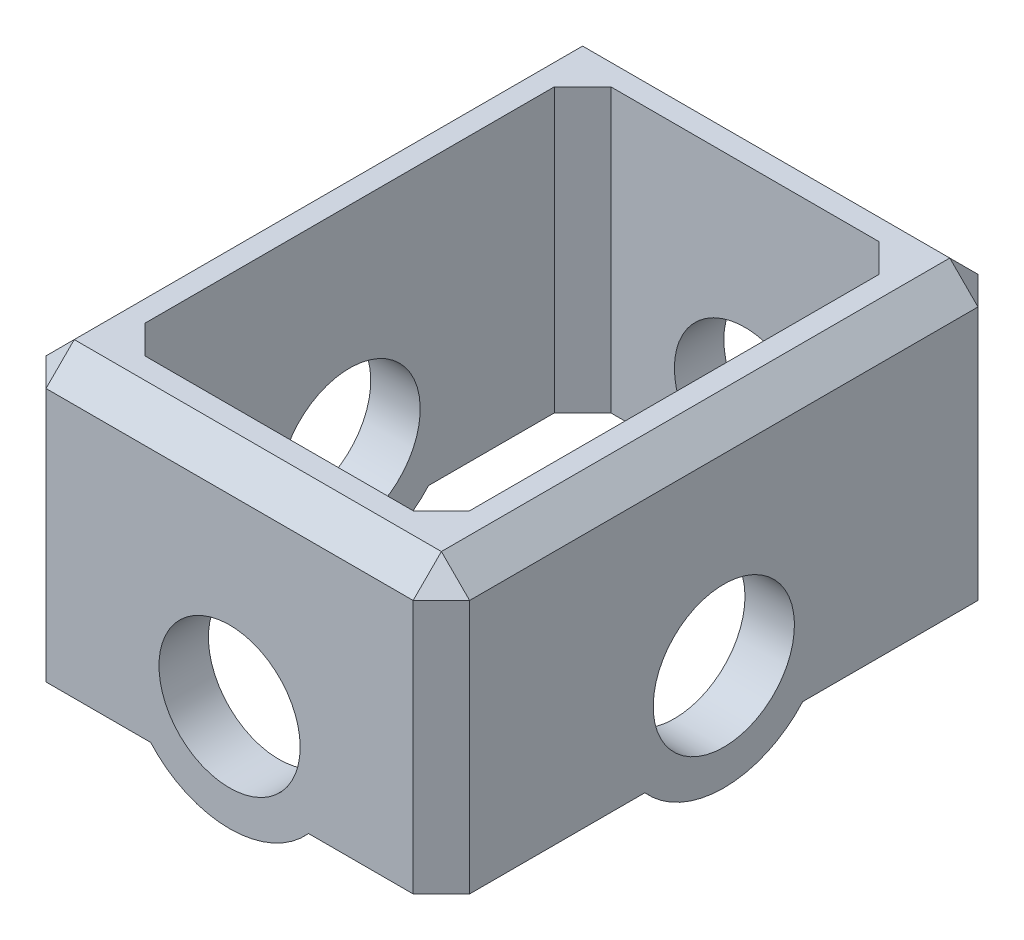
ISO-10303-21;
HEADER;
FILE_DESCRIPTION(('STEP AP214'),'2;1');
FILE_NAME('part.step','',(''),(''),'','','');
FILE_SCHEMA(('AUTOMOTIVE_DESIGN { 1 0 10303 214 1 1 1 1 }'));
ENDSEC;
DATA;
#1=APPLICATION_CONTEXT('core data for automotive mechanical design processes');
#2=APPLICATION_PROTOCOL_DEFINITION('international standard','automotive_design',2000,#1);
#3=PRODUCT_CONTEXT('',#1,'mechanical');
#4=PRODUCT('Part','Part','',(#3));
#5=PRODUCT_RELATED_PRODUCT_CATEGORY('part','',(#4));
#6=PRODUCT_DEFINITION_FORMATION('','',#4);
#7=PRODUCT_DEFINITION_CONTEXT('part definition',#1,'design');
#8=PRODUCT_DEFINITION('design','',#6,#7);
#9=PRODUCT_DEFINITION_SHAPE('','',#8);
#10=(LENGTH_UNIT() NAMED_UNIT(*) SI_UNIT(.MILLI.,.METRE.));
#11=(NAMED_UNIT(*) PLANE_ANGLE_UNIT() SI_UNIT($,.RADIAN.));
#12=(NAMED_UNIT(*) SI_UNIT($,.STERADIAN.) SOLID_ANGLE_UNIT());
#13=UNCERTAINTY_MEASURE_WITH_UNIT(LENGTH_MEASURE(1.E-05),#10,'distance_accuracy_value','');
#14=(GEOMETRIC_REPRESENTATION_CONTEXT(3) GLOBAL_UNCERTAINTY_ASSIGNED_CONTEXT((#13)) GLOBAL_UNIT_ASSIGNED_CONTEXT((#10,
#11,#12)) REPRESENTATION_CONTEXT('',''));
#15=CARTESIAN_POINT('',(0.,0.,0.));
#16=DIRECTION('',(0.,0.,1.));
#17=DIRECTION('',(1.,0.,0.));
#18=AXIS2_PLACEMENT_3D('',#15,#16,#17);
#19=CARTESIAN_POINT('',(0.,-10.,40.));
#20=DIRECTION('',(0.,-1.,0.));
#21=DIRECTION('',(0.,0.,-1.));
#22=AXIS2_PLACEMENT_3D('',#19,#20,#21);
#23=PLANE('',#22);
#24=DIRECTION('',(-1.,0.,0.));
#25=VECTOR('',#24,1.);
#26=CARTESIAN_POINT('',(0.,-10.,0.));
#27=LINE('',#26,#25);
#28=CARTESIAN_POINT('',(13.,-10.,0.));
#29=VERTEX_POINT('',#28);
#30=CARTESIAN_POINT('',(5.59016994374947,-10.,0.));
#31=VERTEX_POINT('',#30);
#32=EDGE_CURVE('E350',#29,#31,#27,.T.);
#33=ORIENTED_EDGE('',*,*,#32,.F.);
#34=DIRECTION('',(0.707106781186546,0.,0.707106781186549));
#35=VECTOR('',#34,1.);
#36=CARTESIAN_POINT('',(26.5,-10.,13.5000000000001));
#37=LINE('',#36,#35);
#38=CARTESIAN_POINT('',(15.,-10.,2.00000000000002));
#39=VERTEX_POINT('',#38);
#40=EDGE_CURVE('E441',#29,#39,#37,.T.);
#41=ORIENTED_EDGE('',*,*,#40,.T.);
#42=DIRECTION('',(0.,0.,-1.));
#43=VECTOR('',#42,1.);
#44=CARTESIAN_POINT('',(15.,-10.,40.));
#45=LINE('',#44,#43);
#46=CARTESIAN_POINT('',(15.,-10.,14.4098300562505));
#47=VERTEX_POINT('',#46);
#48=EDGE_CURVE('E244',#47,#39,#45,.T.);
#49=ORIENTED_EDGE('',*,*,#48,.F.);
#50=DIRECTION('',(1.,0.,0.));
#51=VECTOR('',#50,1.);
#52=CARTESIAN_POINT('',(11.5,-10.,14.4098300562505));
#53=LINE('',#52,#51);
#54=CARTESIAN_POINT('',(11.5,-10.,14.4098300562505));
#55=VERTEX_POINT('',#54);
#56=EDGE_CURVE('E241',#55,#47,#53,.T.);
#57=ORIENTED_EDGE('',*,*,#56,.F.);
#58=DIRECTION('',(0.,0.,-1.));
#59=VECTOR('',#58,1.);
#60=CARTESIAN_POINT('',(11.5,-10.,36.5));
#61=LINE('',#60,#59);
#62=CARTESIAN_POINT('',(11.5,-10.,5.49999999999999));
#63=VERTEX_POINT('',#62);
#64=EDGE_CURVE('E224',#55,#63,#61,.T.);
#65=ORIENTED_EDGE('',*,*,#64,.T.);
#66=DIRECTION('',(0.707106781186551,0.,0.707106781186544));
#67=VECTOR('',#66,1.);
#68=CARTESIAN_POINT('',(9.49999999999999,-10.,3.5));
#69=LINE('',#68,#67);
#70=CARTESIAN_POINT('',(9.49999999999999,-10.,3.5));
#71=VERTEX_POINT('',#70);
#72=EDGE_CURVE('E11',#63,#71,#69,.F.);
#73=ORIENTED_EDGE('',*,*,#72,.T.);
#74=DIRECTION('',(-1.,0.,0.));
#75=VECTOR('',#74,1.);
#76=CARTESIAN_POINT('',(11.5,-10.,3.5));
#77=LINE('',#76,#75);
#78=CARTESIAN_POINT('',(5.59016994374947,-10.,3.5));
#79=VERTEX_POINT('',#78);
#80=EDGE_CURVE('E293',#71,#79,#77,.T.);
#81=ORIENTED_EDGE('',*,*,#80,.T.);
#82=DIRECTION('',(0.,0.,-1.));
#83=VECTOR('',#82,1.);
#84=CARTESIAN_POINT('',(5.59016994374947,-10.,40.));
#85=LINE('',#84,#83);
#86=EDGE_CURVE('E365',#79,#31,#85,.T.);
#87=ORIENTED_EDGE('',*,*,#86,.T.);
#88=EDGE_LOOP('',(#33,#41,#49,#57,#65,#73,#81,#87));
#89=FACE_BOUND('',#88,.T.);
#90=ADVANCED_FACE('F49',(#89),#23,.T.);
#91=CARTESIAN_POINT('',(15.,-10.,38.));
#92=VERTEX_POINT('',#91);
#93=CARTESIAN_POINT('',(15.,-10.,25.5901699437495));
#94=VERTEX_POINT('',#93);
#95=EDGE_CURVE('E362',#92,#94,#45,.T.);
#96=ORIENTED_EDGE('',*,*,#95,.F.);
#97=DIRECTION('',(0.707106781186546,0.,-0.707106781186549));
#98=VECTOR('',#97,1.);
#99=CARTESIAN_POINT('',(6.50000000000002,-10.,46.5));
#100=LINE('',#99,#98);
#101=CARTESIAN_POINT('',(13.,-10.,40.));
#102=VERTEX_POINT('',#101);
#103=EDGE_CURVE('E429',#92,#102,#100,.F.);
#104=ORIENTED_EDGE('',*,*,#103,.T.);
#105=DIRECTION('',(-1.,0.,0.));
#106=VECTOR('',#105,1.);
#107=CARTESIAN_POINT('',(0.,-10.,40.));
#108=LINE('',#107,#106);
#109=CARTESIAN_POINT('',(5.59016994374947,-10.,40.));
#110=VERTEX_POINT('',#109);
#111=EDGE_CURVE('E339',#102,#110,#108,.T.);
#112=ORIENTED_EDGE('',*,*,#111,.T.);
#113=CARTESIAN_POINT('',(5.59016994374947,-10.,36.5));
#114=VERTEX_POINT('',#113);
#115=EDGE_CURVE('E366',#110,#114,#85,.T.);
#116=ORIENTED_EDGE('',*,*,#115,.T.);
#117=DIRECTION('',(1.,0.,0.));
#118=VECTOR('',#117,1.);
#119=CARTESIAN_POINT('',(-11.5,-10.,36.5));
#120=LINE('',#119,#118);
#121=CARTESIAN_POINT('',(9.50000000000002,-10.,36.5));
#122=VERTEX_POINT('',#121);
#123=EDGE_CURVE('E322',#114,#122,#120,.T.);
#124=ORIENTED_EDGE('',*,*,#123,.T.);
#125=DIRECTION('',(-0.707106781186544,0.,0.707106781186551));
#126=VECTOR('',#125,1.);
#127=CARTESIAN_POINT('',(11.5,-10.,34.5));
#128=LINE('',#127,#126);
#129=CARTESIAN_POINT('',(11.5,-10.,34.5));
#130=VERTEX_POINT('',#129);
#131=EDGE_CURVE('E460',#122,#130,#128,.F.);
#132=ORIENTED_EDGE('',*,*,#131,.T.);
#133=CARTESIAN_POINT('',(11.5,-10.,25.5901699437495));
#134=VERTEX_POINT('',#133);
#135=EDGE_CURVE('E237',#130,#134,#61,.T.);
#136=ORIENTED_EDGE('',*,*,#135,.T.);
#137=DIRECTION('',(1.,0.,0.));
#138=VECTOR('',#137,1.);
#139=CARTESIAN_POINT('',(11.5,-10.,25.5901699437495));
#140=LINE('',#139,#138);
#141=EDGE_CURVE('E250',#134,#94,#140,.T.);
#142=ORIENTED_EDGE('',*,*,#141,.T.);
#143=EDGE_LOOP('',(#96,#104,#112,#116,#124,#132,#136,#142));
#144=FACE_BOUND('',#143,.T.);
#145=ADVANCED_FACE('F589',(#144),#23,.T.);
#146=CARTESIAN_POINT('',(-5.59016994374948,-10.,40.));
#147=VERTEX_POINT('',#146);
#148=CARTESIAN_POINT('',(-13.,-10.,40.));
#149=VERTEX_POINT('',#148);
#150=EDGE_CURVE('E342',#147,#149,#108,.T.);
#151=ORIENTED_EDGE('',*,*,#150,.T.);
#152=DIRECTION('',(-0.707106781186546,0.,-0.707106781186549));
#153=VECTOR('',#152,1.);
#154=CARTESIAN_POINT('',(-6.50000000000002,-10.,46.5));
#155=LINE('',#154,#153);
#156=CARTESIAN_POINT('',(-15.,-10.,38.));
#157=VERTEX_POINT('',#156);
#158=EDGE_CURVE('E454',#149,#157,#155,.T.);
#159=ORIENTED_EDGE('',*,*,#158,.T.);
#160=DIRECTION('',(0.,0.,-1.));
#161=VECTOR('',#160,1.);
#162=CARTESIAN_POINT('',(-15.,-10.,40.));
#163=LINE('',#162,#161);
#164=CARTESIAN_POINT('',(-15.,-10.,25.5901699437495));
#165=VERTEX_POINT('',#164);
#166=EDGE_CURVE('E359',#157,#165,#163,.T.);
#167=ORIENTED_EDGE('',*,*,#166,.T.);
#168=DIRECTION('',(-1.,0.,0.));
#169=VECTOR('',#168,1.);
#170=CARTESIAN_POINT('',(-11.5,-10.,25.5901699437495));
#171=LINE('',#170,#169);
#172=CARTESIAN_POINT('',(-11.5,-10.,25.5901699437495));
#173=VERTEX_POINT('',#172);
#174=EDGE_CURVE('E274',#173,#165,#171,.T.);
#175=ORIENTED_EDGE('',*,*,#174,.F.);
#176=DIRECTION('',(0.,0.,1.));
#177=VECTOR('',#176,1.);
#178=CARTESIAN_POINT('',(-11.5,-10.,3.5));
#179=LINE('',#178,#177);
#180=CARTESIAN_POINT('',(-11.5,-10.,34.5));
#181=VERTEX_POINT('',#180);
#182=EDGE_CURVE('E278',#173,#181,#179,.T.);
#183=ORIENTED_EDGE('',*,*,#182,.T.);
#184=DIRECTION('',(-0.707106781186551,0.,-0.707106781186544));
#185=VECTOR('',#184,1.);
#186=CARTESIAN_POINT('',(-9.49999999999998,-10.,36.5));
#187=LINE('',#186,#185);
#188=CARTESIAN_POINT('',(-9.49999999999998,-10.,36.5));
#189=VERTEX_POINT('',#188);
#190=EDGE_CURVE('E466',#181,#189,#187,.F.);
#191=ORIENTED_EDGE('',*,*,#190,.T.);
#192=DIRECTION('',(1.,0.,0.));
#193=VECTOR('',#192,1.);
#194=CARTESIAN_POINT('',(-11.5,-10.,36.5));
#195=LINE('',#194,#193);
#196=CARTESIAN_POINT('',(-5.59016994374948,-10.,36.5));
#197=VERTEX_POINT('',#196);
#198=EDGE_CURVE('E315',#189,#197,#195,.T.);
#199=ORIENTED_EDGE('',*,*,#198,.T.);
#200=DIRECTION('',(0.,0.,-1.));
#201=VECTOR('',#200,1.);
#202=CARTESIAN_POINT('',(-5.59016994374948,-10.,40.));
#203=LINE('',#202,#201);
#204=EDGE_CURVE('E353',#147,#197,#203,.T.);
#205=ORIENTED_EDGE('',*,*,#204,.F.);
#206=EDGE_LOOP('',(#151,#159,#167,#175,#183,#191,#199,#205));
#207=FACE_BOUND('',#206,.T.);
#208=ADVANCED_FACE('F569',(#207),#23,.T.);
#209=CARTESIAN_POINT('',(0.,-5.,40.));
#210=DIRECTION('',(0.,0.,-1.));
#211=DIRECTION('',(-1.,0.,0.));
#212=AXIS2_PLACEMENT_3D('',#209,#210,#211);
#213=CYLINDRICAL_SURFACE('',#212,7.5);
#214=ORIENTED_EDGE('',*,*,#86,.F.);
#215=CARTESIAN_POINT('',(0.,-5.,3.5));
#216=DIRECTION('',(0.,0.,-1.));
#217=DIRECTION('',(-1.,0.,0.));
#218=AXIS2_PLACEMENT_3D('',#215,#216,#217);
#219=CIRCLE('',#218,7.5);
#220=CARTESIAN_POINT('',(-5.59016994374948,-10.,3.5));
#221=VERTEX_POINT('',#220);
#222=EDGE_CURVE('E296',#221,#79,#219,.F.);
#223=ORIENTED_EDGE('',*,*,#222,.F.);
#224=CARTESIAN_POINT('',(-5.59016994374948,-10.,0.));
#225=VERTEX_POINT('',#224);
#226=EDGE_CURVE('E358',#221,#225,#203,.T.);
#227=ORIENTED_EDGE('',*,*,#226,.T.);
#228=CARTESIAN_POINT('',(0.,-5.,0.));
#229=DIRECTION('',(0.,0.,1.));
#230=DIRECTION('',(1.,0.,0.));
#231=AXIS2_PLACEMENT_3D('',#228,#229,#230);
#232=CIRCLE('',#231,7.5);
#233=EDGE_CURVE('E346',#225,#31,#232,.T.);
#234=ORIENTED_EDGE('',*,*,#233,.T.);
#235=EDGE_LOOP('',(#214,#223,#227,#234));
#236=FACE_BOUND('',#235,.T.);
#237=ADVANCED_FACE('F650',(#236),#213,.T.);
#238=CARTESIAN_POINT('',(0.,-5.,40.));
#239=DIRECTION('',(0.,0.,-1.));
#240=DIRECTION('',(-1.,0.,0.));
#241=AXIS2_PLACEMENT_3D('',#238,#239,#240);
#242=CYLINDRICAL_SURFACE('',#241,5.);
#243=CARTESIAN_POINT('',(0.,-5.,3.5));
#244=DIRECTION('',(0.,0.,-1.));
#245=DIRECTION('',(-1.,0.,0.));
#246=AXIS2_PLACEMENT_3D('',#243,#244,#245);
#247=CIRCLE('',#246,5.);
#248=CARTESIAN_POINT('',(-5.,-5.,3.5));
#249=VERTEX_POINT('',#248);
#250=EDGE_CURVE('E238',#249,#249,#247,.F.);
#251=ORIENTED_EDGE('',*,*,#250,.T.);
#252=EDGE_LOOP('',(#251));
#253=FACE_BOUND('',#252,.T.);
#254=CARTESIAN_POINT('',(0.,-5.,0.));
#255=DIRECTION('',(0.,0.,1.));
#256=DIRECTION('',(1.,0.,0.));
#257=AXIS2_PLACEMENT_3D('',#254,#255,#256);
#258=CIRCLE('',#257,5.);
#259=CARTESIAN_POINT('',(5.,-5.,0.));
#260=VERTEX_POINT('',#259);
#261=EDGE_CURVE('E326',#260,#260,#258,.T.);
#262=ORIENTED_EDGE('',*,*,#261,.F.);
#263=EDGE_LOOP('',(#262));
#264=FACE_BOUND('',#263,.T.);
#265=ADVANCED_FACE('F648',(#253,#264),#242,.F.);
#266=ORIENTED_EDGE('',*,*,#204,.T.);
#267=CARTESIAN_POINT('',(0.,-5.,36.5));
#268=DIRECTION('',(0.,0.,1.));
#269=DIRECTION('',(1.,0.,0.));
#270=AXIS2_PLACEMENT_3D('',#267,#268,#269);
#271=CIRCLE('',#270,7.5);
#272=EDGE_CURVE('E318',#114,#197,#271,.F.);
#273=ORIENTED_EDGE('',*,*,#272,.F.);
#274=ORIENTED_EDGE('',*,*,#115,.F.);
#275=CARTESIAN_POINT('',(0.,-5.,40.));
#276=DIRECTION('',(0.,0.,1.));
#277=DIRECTION('',(1.,0.,0.));
#278=AXIS2_PLACEMENT_3D('',#275,#276,#277);
#279=CIRCLE('',#278,7.5);
#280=EDGE_CURVE('E334',#147,#110,#279,.T.);
#281=ORIENTED_EDGE('',*,*,#280,.F.);
#282=EDGE_LOOP('',(#266,#273,#274,#281));
#283=FACE_BOUND('',#282,.T.);
#284=ADVANCED_FACE('F593',(#283),#213,.T.);
#285=CARTESIAN_POINT('',(15.,0.,40.));
#286=DIRECTION('',(1.,0.,0.));
#287=DIRECTION('',(0.,1.,0.));
#288=AXIS2_PLACEMENT_3D('',#285,#286,#287);
#289=PLANE('',#288);
#290=CARTESIAN_POINT('',(15.,-5.00000000000001,20.));
#291=DIRECTION('',(-1.,0.,0.));
#292=DIRECTION('',(0.,-1.,0.));
#293=AXIS2_PLACEMENT_3D('',#290,#291,#292);
#294=CIRCLE('',#293,5.);
#295=CARTESIAN_POINT('',(15.,-10.,20.));
#296=VERTEX_POINT('',#295);
#297=EDGE_CURVE('E682',#296,#296,#294,.T.);
#298=ORIENTED_EDGE('',*,*,#297,.T.);
#299=EDGE_LOOP('',(#298));
#300=FACE_BOUND('',#299,.T.);
#301=DIRECTION('',(0.,0.,1.));
#302=VECTOR('',#301,1.);
#303=CARTESIAN_POINT('',(15.,7.99999999999998,40.));
#304=LINE('',#303,#302);
#305=CARTESIAN_POINT('',(15.,7.99999999999998,2.00000000000002));
#306=VERTEX_POINT('',#305);
#307=CARTESIAN_POINT('',(15.,7.99999999999998,38.));
#308=VERTEX_POINT('',#307);
#309=EDGE_CURVE('E423',#306,#308,#304,.T.);
#310=ORIENTED_EDGE('',*,*,#309,.T.);
#311=DIRECTION('',(0.,-1.,0.));
#312=VECTOR('',#311,1.);
#313=CARTESIAN_POINT('',(15.,0.,38.));
#314=LINE('',#313,#312);
#315=EDGE_CURVE('E426',#308,#92,#314,.T.);
#316=ORIENTED_EDGE('',*,*,#315,.T.);
#317=ORIENTED_EDGE('',*,*,#95,.T.);
#318=CARTESIAN_POINT('',(15.,-5.,20.));
#319=DIRECTION('',(-1.,0.,0.));
#320=DIRECTION('',(0.,-1.,0.));
#321=AXIS2_PLACEMENT_3D('',#318,#319,#320);
#322=CIRCLE('',#321,7.5);
#323=EDGE_CURVE('E255',#47,#94,#322,.T.);
#324=ORIENTED_EDGE('',*,*,#323,.F.);
#325=ORIENTED_EDGE('',*,*,#48,.T.);
#326=DIRECTION('',(0.,1.,0.));
#327=VECTOR('',#326,1.);
#328=CARTESIAN_POINT('',(15.,10.,2.00000000000002));
#329=LINE('',#328,#327);
#330=EDGE_CURVE('E420',#39,#306,#329,.T.);
#331=ORIENTED_EDGE('',*,*,#330,.T.);
#332=EDGE_LOOP('',(#310,#316,#317,#324,#325,#331));
#333=FACE_BOUND('',#332,.T.);
#334=ADVANCED_FACE('F555',(#300,#333),#289,.T.);
#335=CARTESIAN_POINT('',(0.,10.,40.));
#336=DIRECTION('',(0.,1.,0.));
#337=DIRECTION('',(0.,0.,1.));
#338=AXIS2_PLACEMENT_3D('',#335,#336,#337);
#339=PLANE('',#338);
#340=DIRECTION('',(0.,0.,1.));
#341=VECTOR('',#340,1.);
#342=CARTESIAN_POINT('',(-13.,10.,40.));
#343=LINE('',#342,#341);
#344=CARTESIAN_POINT('',(-13.,10.,2.00000000000002));
#345=VERTEX_POINT('',#344);
#346=CARTESIAN_POINT('',(-13.,10.,38.));
#347=VERTEX_POINT('',#346);
#348=EDGE_CURVE('E397',#345,#347,#343,.T.);
#349=ORIENTED_EDGE('',*,*,#348,.T.);
#350=DIRECTION('',(1.,0.,0.));
#351=VECTOR('',#350,1.);
#352=CARTESIAN_POINT('',(0.,10.,38.));
#353=LINE('',#352,#351);
#354=CARTESIAN_POINT('',(13.,10.,38.));
#355=VERTEX_POINT('',#354);
#356=EDGE_CURVE('E406',#347,#355,#353,.T.);
#357=ORIENTED_EDGE('',*,*,#356,.T.);
#358=DIRECTION('',(0.,0.,-1.));
#359=VECTOR('',#358,1.);
#360=CARTESIAN_POINT('',(13.,10.,40.));
#361=LINE('',#360,#359);
#362=CARTESIAN_POINT('',(13.,10.,2.00000000000002));
#363=VERTEX_POINT('',#362);
#364=EDGE_CURVE('E403',#355,#363,#361,.T.);
#365=ORIENTED_EDGE('',*,*,#364,.T.);
#366=DIRECTION('',(-1.,0.,0.));
#367=VECTOR('',#366,1.);
#368=CARTESIAN_POINT('',(-15.,10.,2.00000000000002));
#369=LINE('',#368,#367);
#370=EDGE_CURVE('E400',#363,#345,#369,.T.);
#371=ORIENTED_EDGE('',*,*,#370,.T.);
#372=EDGE_LOOP('',(#349,#357,#365,#371));
#373=FACE_BOUND('',#372,.T.);
#374=DIRECTION('',(0.,0.,1.));
#375=VECTOR('',#374,1.);
#376=CARTESIAN_POINT('',(-11.5,10.,3.5));
#377=LINE('',#376,#375);
#378=CARTESIAN_POINT('',(-11.5,10.,5.50000000000001));
#379=VERTEX_POINT('',#378);
#380=CARTESIAN_POINT('',(-11.5,10.,34.5));
#381=VERTEX_POINT('',#380);
#382=EDGE_CURVE('E300',#379,#381,#377,.T.);
#383=ORIENTED_EDGE('',*,*,#382,.F.);
#384=DIRECTION('',(-0.707106781186545,0.,0.70710678118655));
#385=VECTOR('',#384,1.);
#386=CARTESIAN_POINT('',(-11.5,10.,5.50000000000001));
#387=LINE('',#386,#385);
#388=CARTESIAN_POINT('',(-9.5,10.,3.5));
#389=VERTEX_POINT('',#388);
#390=EDGE_CURVE('E469',#379,#389,#387,.F.);
#391=ORIENTED_EDGE('',*,*,#390,.T.);
#392=DIRECTION('',(-1.,0.,0.));
#393=VECTOR('',#392,1.);
#394=CARTESIAN_POINT('',(11.5,10.,3.5));
#395=LINE('',#394,#393);
#396=CARTESIAN_POINT('',(9.49999999999999,10.,3.5));
#397=VERTEX_POINT('',#396);
#398=EDGE_CURVE('E311',#397,#389,#395,.T.);
#399=ORIENTED_EDGE('',*,*,#398,.F.);
#400=DIRECTION('',(-0.707106781186551,0.,-0.707106781186544));
#401=VECTOR('',#400,1.);
#402=CARTESIAN_POINT('',(9.49999999999999,10.,3.5));
#403=LINE('',#402,#401);
#404=CARTESIAN_POINT('',(11.5,10.,5.49999999999999));
#405=VERTEX_POINT('',#404);
#406=EDGE_CURVE('E60',#397,#405,#403,.F.);
#407=ORIENTED_EDGE('',*,*,#406,.T.);
#408=DIRECTION('',(0.,0.,-1.));
#409=VECTOR('',#408,1.);
#410=CARTESIAN_POINT('',(11.5,10.,36.5));
#411=LINE('',#410,#409);
#412=CARTESIAN_POINT('',(11.5,10.,34.5));
#413=VERTEX_POINT('',#412);
#414=EDGE_CURVE('E308',#413,#405,#411,.T.);
#415=ORIENTED_EDGE('',*,*,#414,.F.);
#416=DIRECTION('',(0.707106781186544,0.,-0.707106781186551));
#417=VECTOR('',#416,1.);
#418=CARTESIAN_POINT('',(11.5,10.,34.5));
#419=LINE('',#418,#417);
#420=CARTESIAN_POINT('',(9.50000000000002,10.,36.5));
#421=VERTEX_POINT('',#420);
#422=EDGE_CURVE('E457',#413,#421,#419,.F.);
#423=ORIENTED_EDGE('',*,*,#422,.T.);
#424=DIRECTION('',(1.,0.,0.));
#425=VECTOR('',#424,1.);
#426=CARTESIAN_POINT('',(-11.5,10.,36.5));
#427=LINE('',#426,#425);
#428=CARTESIAN_POINT('',(-9.49999999999998,10.,36.5));
#429=VERTEX_POINT('',#428);
#430=EDGE_CURVE('E304',#429,#421,#427,.T.);
#431=ORIENTED_EDGE('',*,*,#430,.F.);
#432=DIRECTION('',(0.707106781186551,0.,0.707106781186544));
#433=VECTOR('',#432,1.);
#434=CARTESIAN_POINT('',(-9.49999999999998,10.,36.5));
#435=LINE('',#434,#433);
#436=EDGE_CURVE('E463',#429,#381,#435,.F.);
#437=ORIENTED_EDGE('',*,*,#436,.T.);
#438=EDGE_LOOP('',(#383,#391,#399,#407,#415,#423,#431,#437));
#439=FACE_BOUND('',#438,.T.);
#440=ADVANCED_FACE('F534',(#373,#439),#339,.T.);
#441=CARTESIAN_POINT('',(-15.,0.,40.));
#442=DIRECTION('',(1.,0.,0.));
#443=DIRECTION('',(0.,1.,0.));
#444=AXIS2_PLACEMENT_3D('',#441,#442,#443);
#445=PLANE('',#444);
#446=CARTESIAN_POINT('',(-15.,-5.,20.));
#447=DIRECTION('',(-1.,0.,0.));
#448=DIRECTION('',(0.,-1.,0.));
#449=AXIS2_PLACEMENT_3D('',#446,#447,#448);
#450=CIRCLE('',#449,5.);
#451=CARTESIAN_POINT('',(-15.,-10.,20.));
#452=VERTEX_POINT('',#451);
#453=EDGE_CURVE('E679',#452,#452,#450,.T.);
#454=ORIENTED_EDGE('',*,*,#453,.F.);
#455=EDGE_LOOP('',(#454));
#456=FACE_BOUND('',#455,.T.);
#457=DIRECTION('',(0.,0.,-1.));
#458=VECTOR('',#457,1.);
#459=CARTESIAN_POINT('',(-15.,7.99999999999998,0.));
#460=LINE('',#459,#458);
#461=CARTESIAN_POINT('',(-15.,7.99999999999998,38.));
#462=VERTEX_POINT('',#461);
#463=CARTESIAN_POINT('',(-15.,7.99999999999998,2.00000000000002));
#464=VERTEX_POINT('',#463);
#465=EDGE_CURVE('E68',#462,#464,#460,.T.);
#466=ORIENTED_EDGE('',*,*,#465,.T.);
#467=DIRECTION('',(0.,-1.,0.));
#468=VECTOR('',#467,1.);
#469=CARTESIAN_POINT('',(-15.,0.,2.00000000000002));
#470=LINE('',#469,#468);
#471=CARTESIAN_POINT('',(-15.,-10.,2.00000000000002));
#472=VERTEX_POINT('',#471);
#473=EDGE_CURVE('E448',#464,#472,#470,.T.);
#474=ORIENTED_EDGE('',*,*,#473,.T.);
#475=CARTESIAN_POINT('',(-15.,-10.,14.4098300562505));
#476=VERTEX_POINT('',#475);
#477=EDGE_CURVE('E357',#476,#472,#163,.T.);
#478=ORIENTED_EDGE('',*,*,#477,.F.);
#479=CARTESIAN_POINT('',(-15.,-5.,20.));
#480=DIRECTION('',(-1.,0.,0.));
#481=DIRECTION('',(0.,-1.,0.));
#482=AXIS2_PLACEMENT_3D('',#479,#480,#481);
#483=CIRCLE('',#482,7.5);
#484=EDGE_CURVE('E249',#476,#165,#483,.T.);
#485=ORIENTED_EDGE('',*,*,#484,.T.);
#486=ORIENTED_EDGE('',*,*,#166,.F.);
#487=DIRECTION('',(0.,1.,0.));
#488=VECTOR('',#487,1.);
#489=CARTESIAN_POINT('',(-15.,10.,38.));
#490=LINE('',#489,#488);
#491=EDGE_CURVE('E73',#157,#462,#490,.T.);
#492=ORIENTED_EDGE('',*,*,#491,.T.);
#493=EDGE_LOOP('',(#466,#474,#478,#485,#486,#492));
#494=FACE_BOUND('',#493,.T.);
#495=ADVANCED_FACE('F645',(#456,#494),#445,.F.);
#496=CARTESIAN_POINT('',(0.,-5.,36.5));
#497=DIRECTION('',(0.,0.,1.));
#498=DIRECTION('',(1.,0.,0.));
#499=AXIS2_PLACEMENT_3D('',#496,#497,#498);
#500=CIRCLE('',#499,5.);
#501=CARTESIAN_POINT('',(5.,-5.,36.5));
#502=VERTEX_POINT('',#501);
#503=EDGE_CURVE('E288',#502,#502,#500,.F.);
#504=ORIENTED_EDGE('',*,*,#503,.T.);
#505=EDGE_LOOP('',(#504));
#506=FACE_BOUND('',#505,.T.);
#507=CARTESIAN_POINT('',(0.,-5.,40.));
#508=DIRECTION('',(0.,0.,1.));
#509=DIRECTION('',(1.,0.,0.));
#510=AXIS2_PLACEMENT_3D('',#507,#508,#509);
#511=CIRCLE('',#510,5.);
#512=CARTESIAN_POINT('',(5.,-5.,40.));
#513=VERTEX_POINT('',#512);
#514=EDGE_CURVE('E330',#513,#513,#511,.T.);
#515=ORIENTED_EDGE('',*,*,#514,.T.);
#516=EDGE_LOOP('',(#515));
#517=FACE_BOUND('',#516,.T.);
#518=ADVANCED_FACE('F636',(#506,#517),#242,.F.);
#519=ORIENTED_EDGE('',*,*,#477,.T.);
#520=DIRECTION('',(-0.707106781186546,0.,0.707106781186549));
#521=VECTOR('',#520,1.);
#522=CARTESIAN_POINT('',(-26.5,-10.,13.5000000000001));
#523=LINE('',#522,#521);
#524=CARTESIAN_POINT('',(-13.,-10.,0.));
#525=VERTEX_POINT('',#524);
#526=EDGE_CURVE('E451',#472,#525,#523,.F.);
#527=ORIENTED_EDGE('',*,*,#526,.T.);
#528=EDGE_CURVE('E335',#225,#525,#27,.T.);
#529=ORIENTED_EDGE('',*,*,#528,.F.);
#530=ORIENTED_EDGE('',*,*,#226,.F.);
#531=DIRECTION('',(-1.,0.,0.));
#532=VECTOR('',#531,1.);
#533=CARTESIAN_POINT('',(11.5,-10.,3.5));
#534=LINE('',#533,#532);
#535=CARTESIAN_POINT('',(-9.5,-10.,3.5));
#536=VERTEX_POINT('',#535);
#537=EDGE_CURVE('E284',#221,#536,#534,.T.);
#538=ORIENTED_EDGE('',*,*,#537,.T.);
#539=DIRECTION('',(0.707106781186545,0.,-0.70710678118655));
#540=VECTOR('',#539,1.);
#541=CARTESIAN_POINT('',(-11.5,-10.,5.50000000000001));
#542=LINE('',#541,#540);
#543=CARTESIAN_POINT('',(-11.5,-10.,5.50000000000001));
#544=VERTEX_POINT('',#543);
#545=EDGE_CURVE('E472',#536,#544,#542,.F.);
#546=ORIENTED_EDGE('',*,*,#545,.T.);
#547=CARTESIAN_POINT('',(-11.5,-10.,14.4098300562505));
#548=VERTEX_POINT('',#547);
#549=EDGE_CURVE('E281',#544,#548,#179,.T.);
#550=ORIENTED_EDGE('',*,*,#549,.T.);
#551=DIRECTION('',(-1.,0.,0.));
#552=VECTOR('',#551,1.);
#553=CARTESIAN_POINT('',(-11.5,-10.,14.4098300562505));
#554=LINE('',#553,#552);
#555=EDGE_CURVE('E270',#548,#476,#554,.T.);
#556=ORIENTED_EDGE('',*,*,#555,.T.);
#557=EDGE_LOOP('',(#519,#527,#529,#530,#538,#546,#550,#556));
#558=FACE_BOUND('',#557,.T.);
#559=ADVANCED_FACE('F627',(#558),#23,.T.);
#560=CARTESIAN_POINT('',(0.,0.,40.));
#561=DIRECTION('',(0.,0.,1.));
#562=DIRECTION('',(1.,0.,0.));
#563=AXIS2_PLACEMENT_3D('',#560,#561,#562);
#564=PLANE('',#563);
#565=ORIENTED_EDGE('',*,*,#514,.F.);
#566=EDGE_LOOP('',(#565));
#567=FACE_BOUND('',#566,.T.);
#568=ORIENTED_EDGE('',*,*,#111,.F.);
#569=DIRECTION('',(0.,1.,0.));
#570=VECTOR('',#569,1.);
#571=CARTESIAN_POINT('',(13.,0.,40.));
#572=LINE('',#571,#570);
#573=CARTESIAN_POINT('',(13.,7.99999999999999,40.));
#574=VERTEX_POINT('',#573);
#575=EDGE_CURVE('E417',#102,#574,#572,.T.);
#576=ORIENTED_EDGE('',*,*,#575,.T.);
#577=DIRECTION('',(-1.,0.,0.));
#578=VECTOR('',#577,1.);
#579=CARTESIAN_POINT('',(0.,7.99999999999999,40.));
#580=LINE('',#579,#578);
#581=CARTESIAN_POINT('',(-13.,7.99999999999999,40.));
#582=VERTEX_POINT('',#581);
#583=EDGE_CURVE('E413',#574,#582,#580,.T.);
#584=ORIENTED_EDGE('',*,*,#583,.T.);
#585=DIRECTION('',(0.,-1.,0.));
#586=VECTOR('',#585,1.);
#587=CARTESIAN_POINT('',(-13.,-10.,40.));
#588=LINE('',#587,#586);
#589=EDGE_CURVE('E410',#582,#149,#588,.T.);
#590=ORIENTED_EDGE('',*,*,#589,.T.);
#591=ORIENTED_EDGE('',*,*,#150,.F.);
#592=ORIENTED_EDGE('',*,*,#280,.T.);
#593=EDGE_LOOP('',(#568,#576,#584,#590,#591,#592));
#594=FACE_BOUND('',#593,.T.);
#595=ADVANCED_FACE('F635',(#567,#594),#564,.T.);
#596=CARTESIAN_POINT('',(0.,0.,0.));
#597=DIRECTION('',(0.,0.,1.));
#598=DIRECTION('',(1.,0.,0.));
#599=AXIS2_PLACEMENT_3D('',#596,#597,#598);
#600=PLANE('',#599);
#601=ORIENTED_EDGE('',*,*,#261,.T.);
#602=EDGE_LOOP('',(#601));
#603=FACE_BOUND('',#602,.T.);
#604=DIRECTION('',(1.,0.,0.));
#605=VECTOR('',#604,1.);
#606=CARTESIAN_POINT('',(15.,7.99999999999999,0.));
#607=LINE('',#606,#605);
#608=CARTESIAN_POINT('',(-13.,7.99999999999999,0.));
#609=VERTEX_POINT('',#608);
#610=CARTESIAN_POINT('',(13.,7.99999999999999,0.));
#611=VERTEX_POINT('',#610);
#612=EDGE_CURVE('E435',#609,#611,#607,.T.);
#613=ORIENTED_EDGE('',*,*,#612,.T.);
#614=DIRECTION('',(0.,-1.,0.));
#615=VECTOR('',#614,1.);
#616=CARTESIAN_POINT('',(13.,-10.,0.));
#617=LINE('',#616,#615);
#618=EDGE_CURVE('E438',#611,#29,#617,.T.);
#619=ORIENTED_EDGE('',*,*,#618,.T.);
#620=ORIENTED_EDGE('',*,*,#32,.T.);
#621=ORIENTED_EDGE('',*,*,#233,.F.);
#622=ORIENTED_EDGE('',*,*,#528,.T.);
#623=DIRECTION('',(0.,1.,0.));
#624=VECTOR('',#623,1.);
#625=CARTESIAN_POINT('',(-13.,0.,0.));
#626=LINE('',#625,#624);
#627=EDGE_CURVE('E432',#525,#609,#626,.T.);
#628=ORIENTED_EDGE('',*,*,#627,.T.);
#629=EDGE_LOOP('',(#613,#619,#620,#621,#622,#628));
#630=FACE_BOUND('',#629,.T.);
#631=ADVANCED_FACE('F545',(#603,#630),#600,.F.);
#632=CARTESIAN_POINT('',(-11.5,-12.501,3.5));
#633=DIRECTION('',(-1.,0.,0.));
#634=DIRECTION('',(0.,0.,1.));
#635=AXIS2_PLACEMENT_3D('',#632,#633,#634);
#636=PLANE('',#635);
#637=CARTESIAN_POINT('',(-11.5,-5.,20.));
#638=DIRECTION('',(-1.,0.,0.));
#639=DIRECTION('',(0.,0.,1.));
#640=AXIS2_PLACEMENT_3D('',#637,#638,#639);
#641=CIRCLE('',#640,5.);
#642=CARTESIAN_POINT('',(-11.5,-5.,25.));
#643=VERTEX_POINT('',#642);
#644=EDGE_CURVE('E263',#643,#643,#641,.T.);
#645=ORIENTED_EDGE('',*,*,#644,.T.);
#646=EDGE_LOOP('',(#645));
#647=FACE_BOUND('',#646,.T.);
#648=ORIENTED_EDGE('',*,*,#382,.T.);
#649=DIRECTION('',(0.,-1.,0.));
#650=VECTOR('',#649,1.);
#651=CARTESIAN_POINT('',(-11.5,-10.,34.5));
#652=LINE('',#651,#650);
#653=EDGE_CURVE('E387',#381,#181,#652,.T.);
#654=ORIENTED_EDGE('',*,*,#653,.T.);
#655=ORIENTED_EDGE('',*,*,#182,.F.);
#656=CARTESIAN_POINT('',(-11.5,-5.,20.));
#657=DIRECTION('',(-1.,0.,0.));
#658=DIRECTION('',(0.,-1.,0.));
#659=AXIS2_PLACEMENT_3D('',#656,#657,#658);
#660=CIRCLE('',#659,7.5);
#661=EDGE_CURVE('E266',#548,#173,#660,.T.);
#662=ORIENTED_EDGE('',*,*,#661,.F.);
#663=ORIENTED_EDGE('',*,*,#549,.F.);
#664=DIRECTION('',(0.,1.,0.));
#665=VECTOR('',#664,1.);
#666=CARTESIAN_POINT('',(-11.5,10.,5.50000000000001));
#667=LINE('',#666,#665);
#668=EDGE_CURVE('E383',#544,#379,#667,.T.);
#669=ORIENTED_EDGE('',*,*,#668,.T.);
#670=EDGE_LOOP('',(#648,#654,#655,#662,#663,#669));
#671=FACE_BOUND('',#670,.T.);
#672=ADVANCED_FACE('F694',(#647,#671),#636,.F.);
#673=CARTESIAN_POINT('',(11.5,-12.501,3.5));
#674=DIRECTION('',(0.,0.,-1.));
#675=DIRECTION('',(-1.,0.,0.));
#676=AXIS2_PLACEMENT_3D('',#673,#674,#675);
#677=PLANE('',#676);
#678=ORIENTED_EDGE('',*,*,#250,.F.);
#679=EDGE_LOOP('',(#678));
#680=FACE_BOUND('',#679,.T.);
#681=ORIENTED_EDGE('',*,*,#398,.T.);
#682=DIRECTION('',(0.,-1.,0.));
#683=VECTOR('',#682,1.);
#684=CARTESIAN_POINT('',(-9.5,-10.,3.5));
#685=LINE('',#684,#683);
#686=EDGE_CURVE('E394',#389,#536,#685,.T.);
#687=ORIENTED_EDGE('',*,*,#686,.T.);
#688=ORIENTED_EDGE('',*,*,#537,.F.);
#689=ORIENTED_EDGE('',*,*,#222,.T.);
#690=ORIENTED_EDGE('',*,*,#80,.F.);
#691=DIRECTION('',(0.,1.,0.));
#692=VECTOR('',#691,1.);
#693=CARTESIAN_POINT('',(9.49999999999999,10.,3.5));
#694=LINE('',#693,#692);
#695=EDGE_CURVE('E390',#71,#397,#694,.T.);
#696=ORIENTED_EDGE('',*,*,#695,.T.);
#697=EDGE_LOOP('',(#681,#687,#688,#689,#690,#696));
#698=FACE_BOUND('',#697,.T.);
#699=ADVANCED_FACE('F710',(#680,#698),#677,.F.);
#700=CARTESIAN_POINT('',(11.5,-12.501,36.5));
#701=DIRECTION('',(1.,0.,0.));
#702=DIRECTION('',(0.,0.,-1.));
#703=AXIS2_PLACEMENT_3D('',#700,#701,#702);
#704=PLANE('',#703);
#705=CARTESIAN_POINT('',(11.5,-5.00000000000001,20.));
#706=DIRECTION('',(1.,0.,0.));
#707=DIRECTION('',(0.,0.,-1.));
#708=AXIS2_PLACEMENT_3D('',#705,#706,#707);
#709=CIRCLE('',#708,5.);
#710=CARTESIAN_POINT('',(11.5,-5.00000000000001,15.));
#711=VERTEX_POINT('',#710);
#712=EDGE_CURVE('E54',#711,#711,#709,.T.);
#713=ORIENTED_EDGE('',*,*,#712,.T.);
#714=EDGE_LOOP('',(#713));
#715=FACE_BOUND('',#714,.T.);
#716=ORIENTED_EDGE('',*,*,#135,.F.);
#717=DIRECTION('',(0.,1.,0.));
#718=VECTOR('',#717,1.);
#719=CARTESIAN_POINT('',(11.5,10.,34.5));
#720=LINE('',#719,#718);
#721=EDGE_CURVE('E372',#130,#413,#720,.T.);
#722=ORIENTED_EDGE('',*,*,#721,.T.);
#723=ORIENTED_EDGE('',*,*,#414,.T.);
#724=DIRECTION('',(0.,-1.,0.));
#725=VECTOR('',#724,1.);
#726=CARTESIAN_POINT('',(11.5,-10.,5.49999999999999));
#727=LINE('',#726,#725);
#728=EDGE_CURVE('E233',#405,#63,#727,.T.);
#729=ORIENTED_EDGE('',*,*,#728,.T.);
#730=ORIENTED_EDGE('',*,*,#64,.F.);
#731=CARTESIAN_POINT('',(11.5,-5.,20.));
#732=DIRECTION('',(-1.,0.,0.));
#733=DIRECTION('',(0.,-1.,0.));
#734=AXIS2_PLACEMENT_3D('',#731,#732,#733);
#735=CIRCLE('',#734,7.5);
#736=EDGE_CURVE('E229',#55,#134,#735,.T.);
#737=ORIENTED_EDGE('',*,*,#736,.T.);
#738=EDGE_LOOP('',(#716,#722,#723,#729,#730,#737));
#739=FACE_BOUND('',#738,.T.);
#740=ADVANCED_FACE('F227',(#715,#739),#704,.F.);
#741=CARTESIAN_POINT('',(-11.5,-12.501,36.5));
#742=DIRECTION('',(0.,0.,1.));
#743=DIRECTION('',(1.,0.,0.));
#744=AXIS2_PLACEMENT_3D('',#741,#742,#743);
#745=PLANE('',#744);
#746=ORIENTED_EDGE('',*,*,#503,.F.);
#747=EDGE_LOOP('',(#746));
#748=FACE_BOUND('',#747,.T.);
#749=ORIENTED_EDGE('',*,*,#430,.T.);
#750=DIRECTION('',(0.,-1.,0.));
#751=VECTOR('',#750,1.);
#752=CARTESIAN_POINT('',(9.50000000000002,-10.,36.5));
#753=LINE('',#752,#751);
#754=EDGE_CURVE('E380',#421,#122,#753,.T.);
#755=ORIENTED_EDGE('',*,*,#754,.T.);
#756=ORIENTED_EDGE('',*,*,#123,.F.);
#757=ORIENTED_EDGE('',*,*,#272,.T.);
#758=ORIENTED_EDGE('',*,*,#198,.F.);
#759=DIRECTION('',(0.,1.,0.));
#760=VECTOR('',#759,1.);
#761=CARTESIAN_POINT('',(-9.49999999999998,10.,36.5));
#762=LINE('',#761,#760);
#763=EDGE_CURVE('E376',#189,#429,#762,.T.);
#764=ORIENTED_EDGE('',*,*,#763,.T.);
#765=EDGE_LOOP('',(#749,#755,#756,#757,#758,#764));
#766=FACE_BOUND('',#765,.T.);
#767=ADVANCED_FACE('F579',(#748,#766),#745,.F.);
#768=CARTESIAN_POINT('',(-11.5,-5.,20.));
#769=DIRECTION('',(-1.,0.,0.));
#770=DIRECTION('',(0.,-1.,0.));
#771=AXIS2_PLACEMENT_3D('',#768,#769,#770);
#772=CYLINDRICAL_SURFACE('',#771,7.5);
#773=ORIENTED_EDGE('',*,*,#484,.F.);
#774=ORIENTED_EDGE('',*,*,#555,.F.);
#775=ORIENTED_EDGE('',*,*,#661,.T.);
#776=ORIENTED_EDGE('',*,*,#174,.T.);
#777=EDGE_LOOP('',(#773,#774,#775,#776));
#778=FACE_BOUND('',#777,.T.);
#779=ADVANCED_FACE('F706',(#778),#772,.T.);
#780=CARTESIAN_POINT('',(11.5,-5.,20.));
#781=DIRECTION('',(1.,0.,0.));
#782=DIRECTION('',(0.,1.,0.));
#783=AXIS2_PLACEMENT_3D('',#780,#781,#782);
#784=CYLINDRICAL_SURFACE('',#783,7.5);
#785=ORIENTED_EDGE('',*,*,#323,.T.);
#786=ORIENTED_EDGE('',*,*,#141,.F.);
#787=ORIENTED_EDGE('',*,*,#736,.F.);
#788=ORIENTED_EDGE('',*,*,#56,.T.);
#789=EDGE_LOOP('',(#785,#786,#787,#788));
#790=FACE_BOUND('',#789,.T.);
#791=ADVANCED_FACE('F252',(#790),#784,.T.);
#792=CARTESIAN_POINT('',(11.5,-12.501,34.5));
#793=DIRECTION('',(-0.707106781186551,0.,-0.707106781186544));
#794=DIRECTION('',(0.,-1.,0.));
#795=AXIS2_PLACEMENT_3D('',#792,#793,#794);
#796=PLANE('',#795);
#797=ORIENTED_EDGE('',*,*,#131,.F.);
#798=ORIENTED_EDGE('',*,*,#754,.F.);
#799=ORIENTED_EDGE('',*,*,#422,.F.);
#800=ORIENTED_EDGE('',*,*,#721,.F.);
#801=EDGE_LOOP('',(#797,#798,#799,#800));
#802=FACE_BOUND('',#801,.T.);
#803=ADVANCED_FACE('F586',(#802),#796,.T.);
#804=CARTESIAN_POINT('',(-9.49999999999998,-12.501,36.5));
#805=DIRECTION('',(0.707106781186544,0.,-0.707106781186551));
#806=DIRECTION('',(0.,-1.,0.));
#807=AXIS2_PLACEMENT_3D('',#804,#805,#806);
#808=PLANE('',#807);
#809=ORIENTED_EDGE('',*,*,#190,.F.);
#810=ORIENTED_EDGE('',*,*,#653,.F.);
#811=ORIENTED_EDGE('',*,*,#436,.F.);
#812=ORIENTED_EDGE('',*,*,#763,.F.);
#813=EDGE_LOOP('',(#809,#810,#811,#812));
#814=FACE_BOUND('',#813,.T.);
#815=ADVANCED_FACE('F576',(#814),#808,.T.);
#816=CARTESIAN_POINT('',(-11.5,-12.501,5.50000000000001));
#817=DIRECTION('',(0.70710678118655,0.,0.707106781186545));
#818=DIRECTION('',(0.,-1.,0.));
#819=AXIS2_PLACEMENT_3D('',#816,#817,#818);
#820=PLANE('',#819);
#821=ORIENTED_EDGE('',*,*,#545,.F.);
#822=ORIENTED_EDGE('',*,*,#686,.F.);
#823=ORIENTED_EDGE('',*,*,#390,.F.);
#824=ORIENTED_EDGE('',*,*,#668,.F.);
#825=EDGE_LOOP('',(#821,#822,#823,#824));
#826=FACE_BOUND('',#825,.T.);
#827=ADVANCED_FACE('F756',(#826),#820,.T.);
#828=CARTESIAN_POINT('',(9.49999999999999,-12.501,3.5));
#829=DIRECTION('',(-0.707106781186544,0.,0.707106781186551));
#830=DIRECTION('',(0.,-1.,0.));
#831=AXIS2_PLACEMENT_3D('',#828,#829,#830);
#832=PLANE('',#831);
#833=ORIENTED_EDGE('',*,*,#72,.F.);
#834=ORIENTED_EDGE('',*,*,#728,.F.);
#835=ORIENTED_EDGE('',*,*,#406,.F.);
#836=ORIENTED_EDGE('',*,*,#695,.F.);
#837=EDGE_LOOP('',(#833,#834,#835,#836));
#838=FACE_BOUND('',#837,.T.);
#839=ADVANCED_FACE('F764',(#838),#832,.T.);
#840=CARTESIAN_POINT('',(-15.,0.,2.00000000000002));
#841=DIRECTION('',(0.707106781186549,0.,0.707106781186546));
#842=DIRECTION('',(0.,-1.,0.));
#843=AXIS2_PLACEMENT_3D('',#840,#841,#842);
#844=PLANE('',#843);
#845=ORIENTED_EDGE('',*,*,#526,.F.);
#846=ORIENTED_EDGE('',*,*,#473,.F.);
#847=DIRECTION('',(0.707106781186546,0.,-0.707106781186549));
#848=VECTOR('',#847,1.);
#849=CARTESIAN_POINT('',(-14.,7.99999999999999,1.00000000000001));
#850=LINE('',#849,#848);
#851=EDGE_CURVE('E260',#609,#464,#850,.F.);
#852=ORIENTED_EDGE('',*,*,#851,.F.);
#853=ORIENTED_EDGE('',*,*,#627,.F.);
#854=EDGE_LOOP('',(#845,#846,#852,#853));
#855=FACE_BOUND('',#854,.T.);
#856=ADVANCED_FACE('F52',(#855),#844,.F.);
#857=CARTESIAN_POINT('',(0.,7.99999999999999,0.));
#858=DIRECTION('',(0.,0.707106781186549,-0.707106781186546));
#859=DIRECTION('',(-1.,0.,0.));
#860=AXIS2_PLACEMENT_3D('',#857,#858,#859);
#861=PLANE('',#860);
#862=DIRECTION('',(0.,0.707106781186546,0.707106781186549));
#863=VECTOR('',#862,1.);
#864=CARTESIAN_POINT('',(13.,10.,2.00000000000002));
#865=LINE('',#864,#863);
#866=EDGE_CURVE('E511',#611,#363,#865,.T.);
#867=ORIENTED_EDGE('',*,*,#866,.F.);
#868=ORIENTED_EDGE('',*,*,#612,.F.);
#869=DIRECTION('',(0.,-0.707106781186546,-0.707106781186549));
#870=VECTOR('',#869,1.);
#871=CARTESIAN_POINT('',(-13.,10.,2.00000000000002));
#872=LINE('',#871,#870);
#873=EDGE_CURVE('E515',#345,#609,#872,.T.);
#874=ORIENTED_EDGE('',*,*,#873,.F.);
#875=ORIENTED_EDGE('',*,*,#370,.F.);
#876=EDGE_LOOP('',(#867,#868,#874,#875));
#877=FACE_BOUND('',#876,.T.);
#878=ADVANCED_FACE('F542',(#877),#861,.T.);
#879=CARTESIAN_POINT('',(13.,0.,0.));
#880=DIRECTION('',(0.707106781186549,0.,-0.707106781186546));
#881=DIRECTION('',(0.,1.,0.));
#882=AXIS2_PLACEMENT_3D('',#879,#880,#881);
#883=PLANE('',#882);
#884=ORIENTED_EDGE('',*,*,#40,.F.);
#885=ORIENTED_EDGE('',*,*,#618,.F.);
#886=DIRECTION('',(-0.707106781186546,0.,-0.707106781186549));
#887=VECTOR('',#886,1.);
#888=CARTESIAN_POINT('',(14.,7.99999999999999,1.00000000000001));
#889=LINE('',#888,#887);
#890=EDGE_CURVE('E507',#306,#611,#889,.T.);
#891=ORIENTED_EDGE('',*,*,#890,.F.);
#892=ORIENTED_EDGE('',*,*,#330,.F.);
#893=EDGE_LOOP('',(#884,#885,#891,#892));
#894=FACE_BOUND('',#893,.T.);
#895=ADVANCED_FACE('F550',(#894),#883,.T.);
#896=CARTESIAN_POINT('',(-13.,10.,2.00000000000002));
#897=DIRECTION('',(-0.577350269189628,0.577350269189626,-0.577350269189624));
#898=DIRECTION('',(-0.707106781186546,-0.707106781186549,0.));
#899=AXIS2_PLACEMENT_3D('',#896,#897,#898);
#900=PLANE('',#899);
#901=ORIENTED_EDGE('',*,*,#873,.T.);
#902=ORIENTED_EDGE('',*,*,#851,.T.);
#903=DIRECTION('',(0.707106781186546,0.707106781186549,0.));
#904=VECTOR('',#903,1.);
#905=CARTESIAN_POINT('',(-13.,10.,2.00000000000002));
#906=LINE('',#905,#904);
#907=EDGE_CURVE('E503',#345,#464,#906,.F.);
#908=ORIENTED_EDGE('',*,*,#907,.F.);
#909=EDGE_LOOP('',(#901,#902,#908));
#910=FACE_BOUND('',#909,.T.);
#911=ADVANCED_FACE('F523',(#910),#900,.T.);
#912=CARTESIAN_POINT('',(13.,10.,2.00000000000002));
#913=DIRECTION('',(0.577350269189628,0.577350269189626,-0.577350269189624));
#914=DIRECTION('',(-0.707106781186546,0.707106781186549,0.));
#915=AXIS2_PLACEMENT_3D('',#912,#913,#914);
#916=PLANE('',#915);
#917=ORIENTED_EDGE('',*,*,#890,.T.);
#918=ORIENTED_EDGE('',*,*,#866,.T.);
#919=DIRECTION('',(-0.707106781186546,0.707106781186549,0.));
#920=VECTOR('',#919,1.);
#921=CARTESIAN_POINT('',(13.,10.,2.00000000000002));
#922=LINE('',#921,#920);
#923=EDGE_CURVE('E499',#306,#363,#922,.T.);
#924=ORIENTED_EDGE('',*,*,#923,.F.);
#925=EDGE_LOOP('',(#917,#918,#924));
#926=FACE_BOUND('',#925,.T.);
#927=ADVANCED_FACE('F615',(#926),#916,.T.);
#928=CARTESIAN_POINT('',(-13.,0.,40.));
#929=DIRECTION('',(-0.707106781186549,0.,0.707106781186546));
#930=DIRECTION('',(0.,1.,0.));
#931=AXIS2_PLACEMENT_3D('',#928,#929,#930);
#932=PLANE('',#931);
#933=ORIENTED_EDGE('',*,*,#158,.F.);
#934=ORIENTED_EDGE('',*,*,#589,.F.);
#935=DIRECTION('',(0.707106781186546,0.,0.707106781186549));
#936=VECTOR('',#935,1.);
#937=CARTESIAN_POINT('',(-13.,7.99999999999999,40.));
#938=LINE('',#937,#936);
#939=EDGE_CURVE('E495',#462,#582,#938,.T.);
#940=ORIENTED_EDGE('',*,*,#939,.F.);
#941=ORIENTED_EDGE('',*,*,#491,.F.);
#942=EDGE_LOOP('',(#933,#934,#940,#941));
#943=FACE_BOUND('',#942,.T.);
#944=ADVANCED_FACE('F600',(#943),#932,.T.);
#945=CARTESIAN_POINT('',(-15.,7.99999999999998,40.));
#946=DIRECTION('',(-0.707106781186549,0.707106781186546,0.));
#947=DIRECTION('',(0.,0.,1.));
#948=AXIS2_PLACEMENT_3D('',#945,#946,#947);
#949=PLANE('',#948);
#950=ORIENTED_EDGE('',*,*,#907,.T.);
#951=ORIENTED_EDGE('',*,*,#465,.F.);
#952=DIRECTION('',(-0.707106781186546,-0.707106781186549,0.));
#953=VECTOR('',#952,1.);
#954=CARTESIAN_POINT('',(-14.,8.99999999999999,38.));
#955=LINE('',#954,#953);
#956=EDGE_CURVE('E491',#347,#462,#955,.T.);
#957=ORIENTED_EDGE('',*,*,#956,.F.);
#958=ORIENTED_EDGE('',*,*,#348,.F.);
#959=EDGE_LOOP('',(#950,#951,#957,#958));
#960=FACE_BOUND('',#959,.T.);
#961=ADVANCED_FACE('F529',(#960),#949,.T.);
#962=CARTESIAN_POINT('',(13.,10.,40.));
#963=DIRECTION('',(-0.707106781186549,-0.707106781186546,0.));
#964=DIRECTION('',(0.,0.,-1.));
#965=AXIS2_PLACEMENT_3D('',#962,#963,#964);
#966=PLANE('',#965);
#967=ORIENTED_EDGE('',*,*,#923,.T.);
#968=ORIENTED_EDGE('',*,*,#364,.F.);
#969=DIRECTION('',(0.707106781186546,-0.707106781186549,0.));
#970=VECTOR('',#969,1.);
#971=CARTESIAN_POINT('',(13.,10.,38.));
#972=LINE('',#971,#970);
#973=EDGE_CURVE('E487',#308,#355,#972,.F.);
#974=ORIENTED_EDGE('',*,*,#973,.F.);
#975=ORIENTED_EDGE('',*,*,#309,.F.);
#976=EDGE_LOOP('',(#967,#968,#974,#975));
#977=FACE_BOUND('',#976,.T.);
#978=ADVANCED_FACE('F613',(#977),#966,.F.);
#979=CARTESIAN_POINT('',(15.,0.,38.));
#980=DIRECTION('',(-0.707106781186549,0.,-0.707106781186546));
#981=DIRECTION('',(0.,-1.,0.));
#982=AXIS2_PLACEMENT_3D('',#979,#980,#981);
#983=PLANE('',#982);
#984=ORIENTED_EDGE('',*,*,#103,.F.);
#985=ORIENTED_EDGE('',*,*,#315,.F.);
#986=DIRECTION('',(-0.707106781186546,0.,0.707106781186549));
#987=VECTOR('',#986,1.);
#988=CARTESIAN_POINT('',(14.,7.99999999999999,39.));
#989=LINE('',#988,#987);
#990=EDGE_CURVE('E483',#574,#308,#989,.F.);
#991=ORIENTED_EDGE('',*,*,#990,.F.);
#992=ORIENTED_EDGE('',*,*,#575,.F.);
#993=EDGE_LOOP('',(#984,#985,#991,#992));
#994=FACE_BOUND('',#993,.T.);
#995=ADVANCED_FACE('F826',(#994),#983,.F.);
#996=CARTESIAN_POINT('',(-13.,7.99999999999999,40.));
#997=DIRECTION('',(-0.577350269189628,0.577350269189626,0.577350269189624));
#998=DIRECTION('',(-0.707106781186546,-0.707106781186549,0.));
#999=AXIS2_PLACEMENT_3D('',#996,#997,#998);
#1000=PLANE('',#999);
#1001=ORIENTED_EDGE('',*,*,#956,.T.);
#1002=ORIENTED_EDGE('',*,*,#939,.T.);
#1003=DIRECTION('',(0.,-0.707106781186546,0.707106781186549));
#1004=VECTOR('',#1003,1.);
#1005=CARTESIAN_POINT('',(-13.,7.99999999999999,40.));
#1006=LINE('',#1005,#1004);
#1007=EDGE_CURVE('E480',#347,#582,#1006,.T.);
#1008=ORIENTED_EDGE('',*,*,#1007,.F.);
#1009=EDGE_LOOP('',(#1001,#1002,#1008));
#1010=FACE_BOUND('',#1009,.T.);
#1011=ADVANCED_FACE('F602',(#1010),#1000,.T.);
#1012=CARTESIAN_POINT('',(13.,10.,38.));
#1013=DIRECTION('',(0.577350269189628,0.577350269189626,0.577350269189624));
#1014=DIRECTION('',(-0.707106781186546,0.707106781186549,0.));
#1015=AXIS2_PLACEMENT_3D('',#1012,#1013,#1014);
#1016=PLANE('',#1015);
#1017=ORIENTED_EDGE('',*,*,#990,.T.);
#1018=ORIENTED_EDGE('',*,*,#973,.T.);
#1019=DIRECTION('',(0.,0.707106781186546,-0.707106781186549));
#1020=VECTOR('',#1019,1.);
#1021=CARTESIAN_POINT('',(13.,10.,38.));
#1022=LINE('',#1021,#1020);
#1023=EDGE_CURVE('E477',#574,#355,#1022,.T.);
#1024=ORIENTED_EDGE('',*,*,#1023,.F.);
#1025=EDGE_LOOP('',(#1017,#1018,#1024));
#1026=FACE_BOUND('',#1025,.T.);
#1027=ADVANCED_FACE('F609',(#1026),#1016,.T.);
#1028=CARTESIAN_POINT('',(0.,10.,38.));
#1029=DIRECTION('',(0.,-0.707106781186549,-0.707106781186546));
#1030=DIRECTION('',(1.,0.,0.));
#1031=AXIS2_PLACEMENT_3D('',#1028,#1029,#1030);
#1032=PLANE('',#1031);
#1033=ORIENTED_EDGE('',*,*,#1007,.T.);
#1034=ORIENTED_EDGE('',*,*,#583,.F.);
#1035=ORIENTED_EDGE('',*,*,#1023,.T.);
#1036=ORIENTED_EDGE('',*,*,#356,.F.);
#1037=EDGE_LOOP('',(#1033,#1034,#1035,#1036));
#1038=FACE_BOUND('',#1037,.T.);
#1039=ADVANCED_FACE('F605',(#1038),#1032,.F.);
#1040=CARTESIAN_POINT('',(15.,-5.00000000000001,20.));
#1041=DIRECTION('',(-1.,0.,0.));
#1042=DIRECTION('',(0.,-1.,0.));
#1043=AXIS2_PLACEMENT_3D('',#1040,#1041,#1042);
#1044=CYLINDRICAL_SURFACE('',#1043,5.);
#1045=ORIENTED_EDGE('',*,*,#297,.F.);
#1046=EDGE_LOOP('',(#1045));
#1047=FACE_BOUND('',#1046,.T.);
#1048=ORIENTED_EDGE('',*,*,#712,.F.);
#1049=EDGE_LOOP('',(#1048));
#1050=FACE_BOUND('',#1049,.T.);
#1051=ADVANCED_FACE('F698',(#1047,#1050),#1044,.F.);
#1052=ORIENTED_EDGE('',*,*,#453,.T.);
#1053=EDGE_LOOP('',(#1052));
#1054=FACE_BOUND('',#1053,.T.);
#1055=ORIENTED_EDGE('',*,*,#644,.F.);
#1056=EDGE_LOOP('',(#1055));
#1057=FACE_BOUND('',#1056,.T.);
#1058=ADVANCED_FACE('F696',(#1054,#1057),#1044,.F.);
#1059=CLOSED_SHELL('',(#90,#145,#208,#237,#265,#284,#334,#440,#495,#518,#559,#595,#631,#672,
#699,#740,#767,#779,#791,#803,#815,#827,#839,#856,#878,#895,#911,#927,#944,#961,#978,#995,#1011,
#1027,#1039,#1051,#1058));
#1060=MANIFOLD_SOLID_BREP('B2',#1059);
#1061=ADVANCED_BREP_SHAPE_REPRESENTATION('',(#18,#1060),#14);
#1062=SHAPE_DEFINITION_REPRESENTATION(#9,#1061);
ENDSEC;
END-ISO-10303-21;
